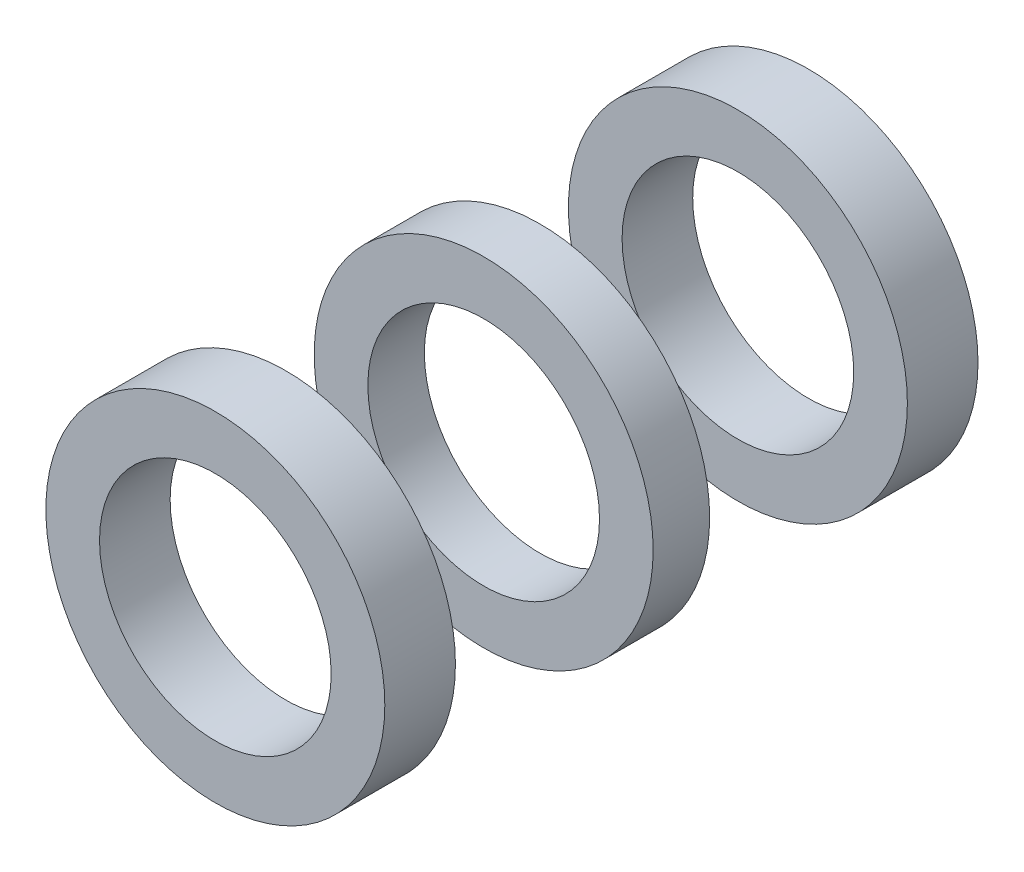
ISO-10303-21;
HEADER;
FILE_DESCRIPTION(('STEP AP214'),'2;1');
FILE_NAME('part.step','',(''),(''),'','','');
FILE_SCHEMA(('AUTOMOTIVE_DESIGN { 1 0 10303 214 1 1 1 1 }'));
ENDSEC;
DATA;
#1=APPLICATION_CONTEXT('core data for automotive mechanical design processes');
#2=APPLICATION_PROTOCOL_DEFINITION('international standard','automotive_design',2000,#1);
#3=PRODUCT_CONTEXT('',#1,'mechanical');
#4=PRODUCT('Part','Part','',(#3));
#5=PRODUCT_RELATED_PRODUCT_CATEGORY('part','',(#4));
#6=PRODUCT_DEFINITION_FORMATION('','',#4);
#7=PRODUCT_DEFINITION_CONTEXT('part definition',#1,'design');
#8=PRODUCT_DEFINITION('design','',#6,#7);
#9=PRODUCT_DEFINITION_SHAPE('','',#8);
#10=(LENGTH_UNIT() NAMED_UNIT(*) SI_UNIT(.MILLI.,.METRE.));
#11=(NAMED_UNIT(*) PLANE_ANGLE_UNIT() SI_UNIT($,.RADIAN.));
#12=(NAMED_UNIT(*) SI_UNIT($,.STERADIAN.) SOLID_ANGLE_UNIT());
#13=UNCERTAINTY_MEASURE_WITH_UNIT(LENGTH_MEASURE(1.E-05),#10,'distance_accuracy_value','');
#14=(GEOMETRIC_REPRESENTATION_CONTEXT(3) GLOBAL_UNCERTAINTY_ASSIGNED_CONTEXT((#13)) GLOBAL_UNIT_ASSIGNED_CONTEXT((#10,
#11,#12)) REPRESENTATION_CONTEXT('',''));
#15=CARTESIAN_POINT('',(0.,0.,0.));
#16=DIRECTION('',(0.,0.,1.));
#17=DIRECTION('',(1.,0.,0.));
#18=AXIS2_PLACEMENT_3D('',#15,#16,#17);
#19=CARTESIAN_POINT('',(0.,0.,55.5));
#20=DIRECTION('',(0.,0.,1.));
#21=DIRECTION('',(1.,0.,0.));
#22=AXIS2_PLACEMENT_3D('',#19,#20,#21);
#23=PLANE('',#22);
#24=CARTESIAN_POINT('',(0.,0.,55.5));
#25=DIRECTION('',(0.,0.,1.));
#26=DIRECTION('',(1.,0.,0.));
#27=AXIS2_PLACEMENT_3D('',#24,#25,#26);
#28=CIRCLE('',#27,6.);
#29=CARTESIAN_POINT('',(6.,0.,55.5));
#30=VERTEX_POINT('',#29);
#31=EDGE_CURVE('E11',#30,#30,#28,.T.);
#32=ORIENTED_EDGE('',*,*,#31,.T.);
#33=EDGE_LOOP('',(#32));
#34=FACE_BOUND('',#33,.T.);
#35=CARTESIAN_POINT('',(0.,0.,55.5));
#36=DIRECTION('',(0.,0.,1.));
#37=DIRECTION('',(1.,0.,0.));
#38=AXIS2_PLACEMENT_3D('',#35,#36,#37);
#39=CIRCLE('',#38,4.1);
#40=CARTESIAN_POINT('',(4.1,0.,55.5));
#41=VERTEX_POINT('',#40);
#42=EDGE_CURVE('E59',#41,#41,#39,.T.);
#43=ORIENTED_EDGE('',*,*,#42,.F.);
#44=EDGE_LOOP('',(#43));
#45=FACE_BOUND('',#44,.T.);
#46=ADVANCED_FACE('F45',(#34,#45),#23,.T.);
#47=CARTESIAN_POINT('',(0.,0.,53.));
#48=DIRECTION('',(0.,0.,1.));
#49=DIRECTION('',(1.,0.,0.));
#50=AXIS2_PLACEMENT_3D('',#47,#48,#49);
#51=PLANE('',#50);
#52=CARTESIAN_POINT('',(0.,0.,53.));
#53=DIRECTION('',(0.,0.,1.));
#54=DIRECTION('',(1.,0.,0.));
#55=AXIS2_PLACEMENT_3D('',#52,#53,#54);
#56=CIRCLE('',#55,6.);
#57=CARTESIAN_POINT('',(6.,0.,53.));
#58=VERTEX_POINT('',#57);
#59=EDGE_CURVE('E49',#58,#58,#56,.T.);
#60=ORIENTED_EDGE('',*,*,#59,.F.);
#61=EDGE_LOOP('',(#60));
#62=FACE_BOUND('',#61,.T.);
#63=CARTESIAN_POINT('',(0.,0.,53.));
#64=DIRECTION('',(0.,0.,1.));
#65=DIRECTION('',(1.,0.,0.));
#66=AXIS2_PLACEMENT_3D('',#63,#64,#65);
#67=CIRCLE('',#66,4.1);
#68=CARTESIAN_POINT('',(4.1,0.,53.));
#69=VERTEX_POINT('',#68);
#70=EDGE_CURVE('E61',#69,#69,#67,.T.);
#71=ORIENTED_EDGE('',*,*,#70,.T.);
#72=EDGE_LOOP('',(#71));
#73=FACE_BOUND('',#72,.T.);
#74=ADVANCED_FACE('F72',(#62,#73),#51,.F.);
#75=CARTESIAN_POINT('',(0.,0.,55.5));
#76=DIRECTION('',(0.,0.,-1.));
#77=DIRECTION('',(-1.,0.,0.));
#78=AXIS2_PLACEMENT_3D('',#75,#76,#77);
#79=CYLINDRICAL_SURFACE('',#78,6.);
#80=ORIENTED_EDGE('',*,*,#31,.F.);
#81=EDGE_LOOP('',(#80));
#82=FACE_BOUND('',#81,.T.);
#83=ORIENTED_EDGE('',*,*,#59,.T.);
#84=EDGE_LOOP('',(#83));
#85=FACE_BOUND('',#84,.T.);
#86=ADVANCED_FACE('F47',(#82,#85),#79,.T.);
#87=CARTESIAN_POINT('',(0.,0.,55.5));
#88=DIRECTION('',(0.,0.,-1.));
#89=DIRECTION('',(-1.,0.,0.));
#90=AXIS2_PLACEMENT_3D('',#87,#88,#89);
#91=CYLINDRICAL_SURFACE('',#90,4.1);
#92=ORIENTED_EDGE('',*,*,#42,.T.);
#93=EDGE_LOOP('',(#92));
#94=FACE_BOUND('',#93,.T.);
#95=ORIENTED_EDGE('',*,*,#70,.F.);
#96=EDGE_LOOP('',(#95));
#97=FACE_BOUND('',#96,.T.);
#98=ADVANCED_FACE('F68',(#94,#97),#91,.F.);
#99=CLOSED_SHELL('',(#46,#74,#86,#98));
#100=MANIFOLD_SOLID_BREP('B2',#99);
#101=CARTESIAN_POINT('',(0.,0.,46.));
#102=DIRECTION('',(0.,0.,1.));
#103=DIRECTION('',(1.,0.,0.));
#104=AXIS2_PLACEMENT_3D('',#101,#102,#103);
#105=PLANE('',#104);
#106=CARTESIAN_POINT('',(0.,0.,46.));
#107=DIRECTION('',(0.,0.,1.));
#108=DIRECTION('',(1.,0.,0.));
#109=AXIS2_PLACEMENT_3D('',#106,#107,#108);
#110=CIRCLE('',#109,6.);
#111=CARTESIAN_POINT('',(6.,0.,46.));
#112=VERTEX_POINT('',#111);
#113=EDGE_CURVE('E44',#112,#112,#110,.T.);
#114=ORIENTED_EDGE('',*,*,#113,.T.);
#115=EDGE_LOOP('',(#114));
#116=FACE_BOUND('',#115,.T.);
#117=CARTESIAN_POINT('',(0.,0.,46.));
#118=DIRECTION('',(0.,0.,1.));
#119=DIRECTION('',(1.,0.,0.));
#120=AXIS2_PLACEMENT_3D('',#117,#118,#119);
#121=CIRCLE('',#120,4.1);
#122=CARTESIAN_POINT('',(4.1,0.,46.));
#123=VERTEX_POINT('',#122);
#124=EDGE_CURVE('E135',#123,#123,#121,.T.);
#125=ORIENTED_EDGE('',*,*,#124,.F.);
#126=EDGE_LOOP('',(#125));
#127=FACE_BOUND('',#126,.T.);
#128=ADVANCED_FACE('F121',(#116,#127),#105,.T.);
#129=CARTESIAN_POINT('',(0.,0.,44.));
#130=DIRECTION('',(0.,0.,1.));
#131=DIRECTION('',(1.,0.,0.));
#132=AXIS2_PLACEMENT_3D('',#129,#130,#131);
#133=PLANE('',#132);
#134=CARTESIAN_POINT('',(0.,0.,44.));
#135=DIRECTION('',(0.,0.,1.));
#136=DIRECTION('',(1.,0.,0.));
#137=AXIS2_PLACEMENT_3D('',#134,#135,#136);
#138=CIRCLE('',#137,6.);
#139=CARTESIAN_POINT('',(6.,0.,44.));
#140=VERTEX_POINT('',#139);
#141=EDGE_CURVE('E125',#140,#140,#138,.T.);
#142=ORIENTED_EDGE('',*,*,#141,.F.);
#143=EDGE_LOOP('',(#142));
#144=FACE_BOUND('',#143,.T.);
#145=CARTESIAN_POINT('',(0.,0.,44.));
#146=DIRECTION('',(0.,0.,1.));
#147=DIRECTION('',(1.,0.,0.));
#148=AXIS2_PLACEMENT_3D('',#145,#146,#147);
#149=CIRCLE('',#148,4.1);
#150=CARTESIAN_POINT('',(4.1,0.,44.));
#151=VERTEX_POINT('',#150);
#152=EDGE_CURVE('E137',#151,#151,#149,.T.);
#153=ORIENTED_EDGE('',*,*,#152,.T.);
#154=EDGE_LOOP('',(#153));
#155=FACE_BOUND('',#154,.T.);
#156=ADVANCED_FACE('F148',(#144,#155),#133,.F.);
#157=CARTESIAN_POINT('',(0.,0.,46.));
#158=DIRECTION('',(0.,0.,-1.));
#159=DIRECTION('',(-1.,0.,0.));
#160=AXIS2_PLACEMENT_3D('',#157,#158,#159);
#161=CYLINDRICAL_SURFACE('',#160,6.);
#162=ORIENTED_EDGE('',*,*,#113,.F.);
#163=EDGE_LOOP('',(#162));
#164=FACE_BOUND('',#163,.T.);
#165=ORIENTED_EDGE('',*,*,#141,.T.);
#166=EDGE_LOOP('',(#165));
#167=FACE_BOUND('',#166,.T.);
#168=ADVANCED_FACE('F123',(#164,#167),#161,.T.);
#169=CARTESIAN_POINT('',(0.,0.,46.));
#170=DIRECTION('',(0.,0.,-1.));
#171=DIRECTION('',(-1.,0.,0.));
#172=AXIS2_PLACEMENT_3D('',#169,#170,#171);
#173=CYLINDRICAL_SURFACE('',#172,4.1);
#174=ORIENTED_EDGE('',*,*,#124,.T.);
#175=EDGE_LOOP('',(#174));
#176=FACE_BOUND('',#175,.T.);
#177=ORIENTED_EDGE('',*,*,#152,.F.);
#178=EDGE_LOOP('',(#177));
#179=FACE_BOUND('',#178,.T.);
#180=ADVANCED_FACE('F144',(#176,#179),#173,.F.);
#181=CLOSED_SHELL('',(#128,#156,#168,#180));
#182=MANIFOLD_SOLID_BREP('B6',#181);
#183=CARTESIAN_POINT('',(0.,0.,37.));
#184=DIRECTION('',(0.,0.,1.));
#185=DIRECTION('',(1.,0.,0.));
#186=AXIS2_PLACEMENT_3D('',#183,#184,#185);
#187=PLANE('',#186);
#188=CARTESIAN_POINT('',(0.,0.,37.));
#189=DIRECTION('',(0.,0.,1.));
#190=DIRECTION('',(1.,0.,0.));
#191=AXIS2_PLACEMENT_3D('',#188,#189,#190);
#192=CIRCLE('',#191,6.);
#193=CARTESIAN_POINT('',(6.,0.,37.));
#194=VERTEX_POINT('',#193);
#195=EDGE_CURVE('E120',#194,#194,#192,.T.);
#196=ORIENTED_EDGE('',*,*,#195,.T.);
#197=EDGE_LOOP('',(#196));
#198=FACE_BOUND('',#197,.T.);
#199=CARTESIAN_POINT('',(0.,0.,37.));
#200=DIRECTION('',(0.,0.,1.));
#201=DIRECTION('',(1.,0.,0.));
#202=AXIS2_PLACEMENT_3D('',#199,#200,#201);
#203=CIRCLE('',#202,4.1);
#204=CARTESIAN_POINT('',(4.1,0.,37.));
#205=VERTEX_POINT('',#204);
#206=EDGE_CURVE('E204',#205,#205,#203,.T.);
#207=ORIENTED_EDGE('',*,*,#206,.F.);
#208=EDGE_LOOP('',(#207));
#209=FACE_BOUND('',#208,.T.);
#210=ADVANCED_FACE('F190',(#198,#209),#187,.T.);
#211=CARTESIAN_POINT('',(0.,0.,34.5));
#212=DIRECTION('',(0.,0.,1.));
#213=DIRECTION('',(1.,0.,0.));
#214=AXIS2_PLACEMENT_3D('',#211,#212,#213);
#215=PLANE('',#214);
#216=CARTESIAN_POINT('',(0.,0.,34.5));
#217=DIRECTION('',(0.,0.,1.));
#218=DIRECTION('',(1.,0.,0.));
#219=AXIS2_PLACEMENT_3D('',#216,#217,#218);
#220=CIRCLE('',#219,6.);
#221=CARTESIAN_POINT('',(6.,0.,34.5));
#222=VERTEX_POINT('',#221);
#223=EDGE_CURVE('E194',#222,#222,#220,.T.);
#224=ORIENTED_EDGE('',*,*,#223,.F.);
#225=EDGE_LOOP('',(#224));
#226=FACE_BOUND('',#225,.T.);
#227=CARTESIAN_POINT('',(0.,0.,34.5));
#228=DIRECTION('',(0.,0.,1.));
#229=DIRECTION('',(1.,0.,0.));
#230=AXIS2_PLACEMENT_3D('',#227,#228,#229);
#231=CIRCLE('',#230,4.1);
#232=CARTESIAN_POINT('',(4.1,0.,34.5));
#233=VERTEX_POINT('',#232);
#234=EDGE_CURVE('E206',#233,#233,#231,.T.);
#235=ORIENTED_EDGE('',*,*,#234,.T.);
#236=EDGE_LOOP('',(#235));
#237=FACE_BOUND('',#236,.T.);
#238=ADVANCED_FACE('F217',(#226,#237),#215,.F.);
#239=CARTESIAN_POINT('',(0.,0.,37.));
#240=DIRECTION('',(0.,0.,-1.));
#241=DIRECTION('',(-1.,0.,0.));
#242=AXIS2_PLACEMENT_3D('',#239,#240,#241);
#243=CYLINDRICAL_SURFACE('',#242,6.);
#244=ORIENTED_EDGE('',*,*,#195,.F.);
#245=EDGE_LOOP('',(#244));
#246=FACE_BOUND('',#245,.T.);
#247=ORIENTED_EDGE('',*,*,#223,.T.);
#248=EDGE_LOOP('',(#247));
#249=FACE_BOUND('',#248,.T.);
#250=ADVANCED_FACE('F192',(#246,#249),#243,.T.);
#251=CARTESIAN_POINT('',(0.,0.,37.));
#252=DIRECTION('',(0.,0.,-1.));
#253=DIRECTION('',(-1.,0.,0.));
#254=AXIS2_PLACEMENT_3D('',#251,#252,#253);
#255=CYLINDRICAL_SURFACE('',#254,4.1);
#256=ORIENTED_EDGE('',*,*,#206,.T.);
#257=EDGE_LOOP('',(#256));
#258=FACE_BOUND('',#257,.T.);
#259=ORIENTED_EDGE('',*,*,#234,.F.);
#260=EDGE_LOOP('',(#259));
#261=FACE_BOUND('',#260,.T.);
#262=ADVANCED_FACE('F213',(#258,#261),#255,.F.);
#263=CLOSED_SHELL('',(#210,#238,#250,#262));
#264=MANIFOLD_SOLID_BREP('B39',#263);
#265=ADVANCED_BREP_SHAPE_REPRESENTATION('',(#18,#100,#182,#264),#14);
#266=SHAPE_DEFINITION_REPRESENTATION(#9,#265);
ENDSEC;
END-ISO-10303-21;
